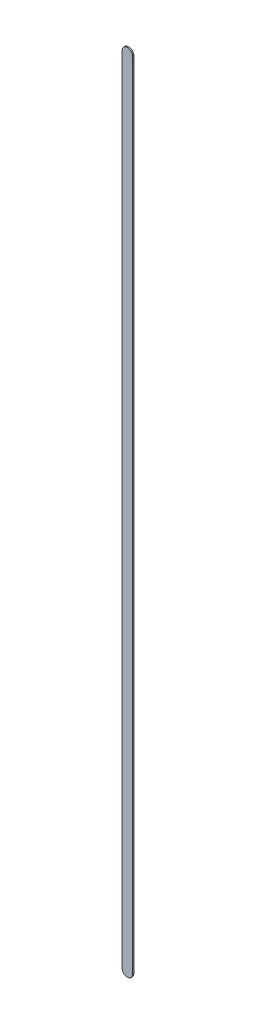
ISO-10303-21;
HEADER;
FILE_DESCRIPTION(('STEP AP214'),'2;1');
FILE_NAME('part.step','',(''),(''),'','','');
FILE_SCHEMA(('AUTOMOTIVE_DESIGN { 1 0 10303 214 1 1 1 1 }'));
ENDSEC;
DATA;
#1=APPLICATION_CONTEXT('core data for automotive mechanical design processes');
#2=APPLICATION_PROTOCOL_DEFINITION('international standard','automotive_design',2000,#1);
#3=PRODUCT_CONTEXT('',#1,'mechanical');
#4=PRODUCT('Part','Part','',(#3));
#5=PRODUCT_RELATED_PRODUCT_CATEGORY('part','',(#4));
#6=PRODUCT_DEFINITION_FORMATION('','',#4);
#7=PRODUCT_DEFINITION_CONTEXT('part definition',#1,'design');
#8=PRODUCT_DEFINITION('design','',#6,#7);
#9=PRODUCT_DEFINITION_SHAPE('','',#8);
#10=(LENGTH_UNIT() NAMED_UNIT(*) SI_UNIT(.MILLI.,.METRE.));
#11=(NAMED_UNIT(*) PLANE_ANGLE_UNIT() SI_UNIT($,.RADIAN.));
#12=(NAMED_UNIT(*) SI_UNIT($,.STERADIAN.) SOLID_ANGLE_UNIT());
#13=UNCERTAINTY_MEASURE_WITH_UNIT(LENGTH_MEASURE(1.E-05),#10,'distance_accuracy_value','');
#14=(GEOMETRIC_REPRESENTATION_CONTEXT(3) GLOBAL_UNCERTAINTY_ASSIGNED_CONTEXT((#13)) GLOBAL_UNIT_ASSIGNED_CONTEXT((#10,
#11,#12)) REPRESENTATION_CONTEXT('',''));
#15=CARTESIAN_POINT('',(0.,0.,0.));
#16=DIRECTION('',(0.,0.,1.));
#17=DIRECTION('',(1.,0.,0.));
#18=AXIS2_PLACEMENT_3D('',#15,#16,#17);
#19=CARTESIAN_POINT('',(74.31,-92.34,1.635));
#20=DIRECTION('',(0.,0.,1.));
#21=DIRECTION('',(1.,0.,0.));
#22=AXIS2_PLACEMENT_3D('',#19,#20,#21);
#23=PLANE('',#22);
#24=DIRECTION('',(0.,-1.,0.));
#25=VECTOR('',#24,1.);
#26=CARTESIAN_POINT('',(74.31,-92.34,1.635));
#27=LINE('',#26,#25);
#28=CARTESIAN_POINT('',(74.31,-92.34,1.635));
#29=VERTEX_POINT('',#28);
#30=CARTESIAN_POINT('',(74.31,-115.16,1.635));
#31=VERTEX_POINT('',#30);
#32=EDGE_CURVE('E82',#29,#31,#27,.T.);
#33=ORIENTED_EDGE('',*,*,#32,.T.);
#34=CARTESIAN_POINT('',(74.46,-115.16,1.635));
#35=DIRECTION('',(0.,0.,1.));
#36=DIRECTION('',(-1.,0.,0.));
#37=AXIS2_PLACEMENT_3D('',#34,#35,#36);
#38=CIRCLE('',#37,0.15);
#39=CARTESIAN_POINT('',(74.61,-115.16,1.635));
#40=VERTEX_POINT('',#39);
#41=EDGE_CURVE('E98',#31,#40,#38,.T.);
#42=ORIENTED_EDGE('',*,*,#41,.T.);
#43=DIRECTION('',(0.,1.,0.));
#44=VECTOR('',#43,1.);
#45=CARTESIAN_POINT('',(74.61,-115.16,1.635));
#46=LINE('',#45,#44);
#47=CARTESIAN_POINT('',(74.61,-92.34,1.635));
#48=VERTEX_POINT('',#47);
#49=EDGE_CURVE('E74',#40,#48,#46,.T.);
#50=ORIENTED_EDGE('',*,*,#49,.T.);
#51=CARTESIAN_POINT('',(74.46,-92.34,1.635));
#52=DIRECTION('',(0.,0.,1.));
#53=DIRECTION('',(1.,0.,0.));
#54=AXIS2_PLACEMENT_3D('',#51,#52,#53);
#55=CIRCLE('',#54,0.15);
#56=EDGE_CURVE('E11',#48,#29,#55,.T.);
#57=ORIENTED_EDGE('',*,*,#56,.T.);
#58=EDGE_LOOP('',(#33,#42,#50,#57));
#59=FACE_BOUND('',#58,.T.);
#60=ADVANCED_FACE('F17',(#59),#23,.T.);
#61=CARTESIAN_POINT('',(74.31,-92.34,1.6));
#62=DIRECTION('',(0.,0.,1.));
#63=DIRECTION('',(1.,0.,0.));
#64=AXIS2_PLACEMENT_3D('',#61,#62,#63);
#65=PLANE('',#64);
#66=CARTESIAN_POINT('',(74.46,-92.34,1.6));
#67=DIRECTION('',(0.,0.,1.));
#68=DIRECTION('',(1.,0.,0.));
#69=AXIS2_PLACEMENT_3D('',#66,#67,#68);
#70=CIRCLE('',#69,0.15);
#71=CARTESIAN_POINT('',(74.61,-92.34,1.6));
#72=VERTEX_POINT('',#71);
#73=CARTESIAN_POINT('',(74.31,-92.34,1.6));
#74=VERTEX_POINT('',#73);
#75=EDGE_CURVE('E25',#72,#74,#70,.T.);
#76=ORIENTED_EDGE('',*,*,#75,.F.);
#77=DIRECTION('',(0.,1.,0.));
#78=VECTOR('',#77,1.);
#79=CARTESIAN_POINT('',(74.61,-115.16,1.6));
#80=LINE('',#79,#78);
#81=CARTESIAN_POINT('',(74.61,-115.16,1.6));
#82=VERTEX_POINT('',#81);
#83=EDGE_CURVE('E101',#82,#72,#80,.T.);
#84=ORIENTED_EDGE('',*,*,#83,.F.);
#85=CARTESIAN_POINT('',(74.46,-115.16,1.6));
#86=DIRECTION('',(0.,0.,1.));
#87=DIRECTION('',(-1.,0.,0.));
#88=AXIS2_PLACEMENT_3D('',#85,#86,#87);
#89=CIRCLE('',#88,0.15);
#90=CARTESIAN_POINT('',(74.31,-115.16,1.6));
#91=VERTEX_POINT('',#90);
#92=EDGE_CURVE('E84',#91,#82,#89,.T.);
#93=ORIENTED_EDGE('',*,*,#92,.F.);
#94=DIRECTION('',(0.,-1.,0.));
#95=VECTOR('',#94,1.);
#96=CARTESIAN_POINT('',(74.31,-92.34,1.6));
#97=LINE('',#96,#95);
#98=EDGE_CURVE('E80',#74,#91,#97,.T.);
#99=ORIENTED_EDGE('',*,*,#98,.F.);
#100=EDGE_LOOP('',(#76,#84,#93,#99));
#101=FACE_BOUND('',#100,.T.);
#102=ADVANCED_FACE('F86',(#101),#65,.F.);
#103=CARTESIAN_POINT('',(74.46,-92.34,1.6));
#104=DIRECTION('',(0.,0.,-1.));
#105=DIRECTION('',(1.,0.,0.));
#106=AXIS2_PLACEMENT_3D('',#103,#104,#105);
#107=CYLINDRICAL_SURFACE('',#106,0.15);
#108=ORIENTED_EDGE('',*,*,#75,.T.);
#109=DIRECTION('',(0.,0.,1.));
#110=VECTOR('',#109,1.);
#111=CARTESIAN_POINT('',(74.31,-92.34,1.6));
#112=LINE('',#111,#110);
#113=EDGE_CURVE('E68',#74,#29,#112,.T.);
#114=ORIENTED_EDGE('',*,*,#113,.T.);
#115=ORIENTED_EDGE('',*,*,#56,.F.);
#116=DIRECTION('',(0.,0.,1.));
#117=VECTOR('',#116,1.);
#118=CARTESIAN_POINT('',(74.61,-92.34,1.6));
#119=LINE('',#118,#117);
#120=EDGE_CURVE('E71',#72,#48,#119,.T.);
#121=ORIENTED_EDGE('',*,*,#120,.F.);
#122=EDGE_LOOP('',(#108,#114,#115,#121));
#123=FACE_BOUND('',#122,.T.);
#124=ADVANCED_FACE('F67',(#123),#107,.T.);
#125=CARTESIAN_POINT('',(74.61,-115.16,1.6));
#126=DIRECTION('',(-1.,0.,0.));
#127=DIRECTION('',(0.,0.,1.));
#128=AXIS2_PLACEMENT_3D('',#125,#126,#127);
#129=PLANE('',#128);
#130=ORIENTED_EDGE('',*,*,#83,.T.);
#131=ORIENTED_EDGE('',*,*,#120,.T.);
#132=ORIENTED_EDGE('',*,*,#49,.F.);
#133=DIRECTION('',(0.,0.,1.));
#134=VECTOR('',#133,1.);
#135=CARTESIAN_POINT('',(74.61,-115.16,1.6));
#136=LINE('',#135,#134);
#137=EDGE_CURVE('E102',#82,#40,#136,.T.);
#138=ORIENTED_EDGE('',*,*,#137,.F.);
#139=EDGE_LOOP('',(#130,#131,#132,#138));
#140=FACE_BOUND('',#139,.T.);
#141=ADVANCED_FACE('F120',(#140),#129,.F.);
#142=CARTESIAN_POINT('',(74.46,-115.16,1.6));
#143=DIRECTION('',(0.,0.,-1.));
#144=DIRECTION('',(-1.,0.,0.));
#145=AXIS2_PLACEMENT_3D('',#142,#143,#144);
#146=CYLINDRICAL_SURFACE('',#145,0.15);
#147=ORIENTED_EDGE('',*,*,#92,.T.);
#148=ORIENTED_EDGE('',*,*,#137,.T.);
#149=ORIENTED_EDGE('',*,*,#41,.F.);
#150=DIRECTION('',(0.,0.,1.));
#151=VECTOR('',#150,1.);
#152=CARTESIAN_POINT('',(74.31,-115.16,1.6));
#153=LINE('',#152,#151);
#154=EDGE_CURVE('E90',#91,#31,#153,.T.);
#155=ORIENTED_EDGE('',*,*,#154,.F.);
#156=EDGE_LOOP('',(#147,#148,#149,#155));
#157=FACE_BOUND('',#156,.T.);
#158=ADVANCED_FACE('F122',(#157),#146,.T.);
#159=CARTESIAN_POINT('',(74.31,-92.34,1.6));
#160=DIRECTION('',(1.,0.,0.));
#161=DIRECTION('',(0.,1.,0.));
#162=AXIS2_PLACEMENT_3D('',#159,#160,#161);
#163=PLANE('',#162);
#164=ORIENTED_EDGE('',*,*,#98,.T.);
#165=ORIENTED_EDGE('',*,*,#154,.T.);
#166=ORIENTED_EDGE('',*,*,#32,.F.);
#167=ORIENTED_EDGE('',*,*,#113,.F.);
#168=EDGE_LOOP('',(#164,#165,#166,#167));
#169=FACE_BOUND('',#168,.T.);
#170=ADVANCED_FACE('F78',(#169),#163,.F.);
#171=CLOSED_SHELL('',(#60,#102,#124,#141,#158,#170));
#172=MANIFOLD_SOLID_BREP('B1',#171);
#173=ADVANCED_BREP_SHAPE_REPRESENTATION('',(#18,#172),#14);
#174=SHAPE_DEFINITION_REPRESENTATION(#9,#173);
ENDSEC;
END-ISO-10303-21;
